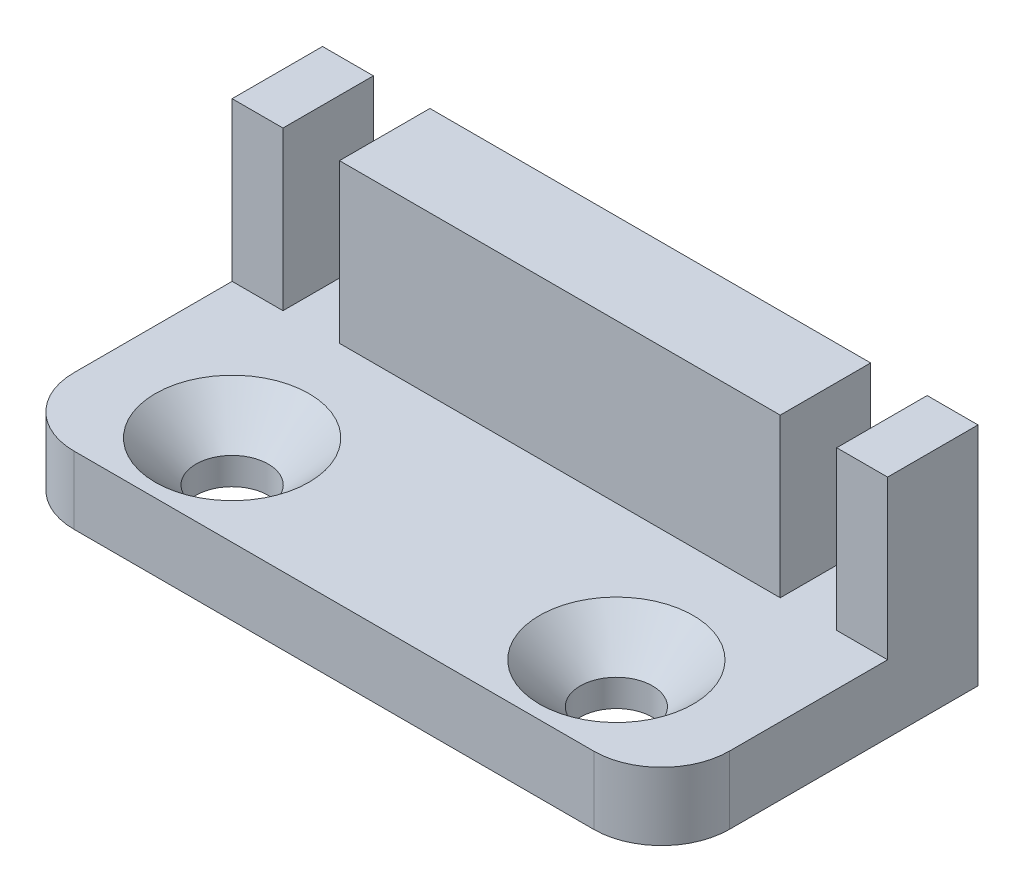
ISO-10303-21;
HEADER;
FILE_DESCRIPTION(('STEP AP214'),'2;1');
FILE_NAME('part.step','',(''),(''),'','','');
FILE_SCHEMA(('AUTOMOTIVE_DESIGN { 1 0 10303 214 1 1 1 1 }'));
ENDSEC;
DATA;
#1=APPLICATION_CONTEXT('core data for automotive mechanical design processes');
#2=APPLICATION_PROTOCOL_DEFINITION('international standard','automotive_design',2000,#1);
#3=PRODUCT_CONTEXT('',#1,'mechanical');
#4=PRODUCT('Part','Part','',(#3));
#5=PRODUCT_RELATED_PRODUCT_CATEGORY('part','',(#4));
#6=PRODUCT_DEFINITION_FORMATION('','',#4);
#7=PRODUCT_DEFINITION_CONTEXT('part definition',#1,'design');
#8=PRODUCT_DEFINITION('design','',#6,#7);
#9=PRODUCT_DEFINITION_SHAPE('','',#8);
#10=(LENGTH_UNIT() NAMED_UNIT(*) SI_UNIT(.MILLI.,.METRE.));
#11=(NAMED_UNIT(*) PLANE_ANGLE_UNIT() SI_UNIT($,.RADIAN.));
#12=(NAMED_UNIT(*) SI_UNIT($,.STERADIAN.) SOLID_ANGLE_UNIT());
#13=UNCERTAINTY_MEASURE_WITH_UNIT(LENGTH_MEASURE(1.E-05),#10,'distance_accuracy_value','');
#14=(GEOMETRIC_REPRESENTATION_CONTEXT(3) GLOBAL_UNCERTAINTY_ASSIGNED_CONTEXT((#13)) GLOBAL_UNIT_ASSIGNED_CONTEXT((#10,
#11,#12)) REPRESENTATION_CONTEXT('',''));
#15=CARTESIAN_POINT('',(0.,0.,0.));
#16=DIRECTION('',(0.,0.,1.));
#17=DIRECTION('',(1.,0.,0.));
#18=AXIS2_PLACEMENT_3D('',#15,#16,#17);
#19=CARTESIAN_POINT('',(0.,0.,4.));
#20=DIRECTION('',(0.,0.,-1.));
#21=DIRECTION('',(-1.,0.,0.));
#22=AXIS2_PLACEMENT_3D('',#19,#20,#21);
#23=PLANE('',#22);
#24=DIRECTION('',(-1.,0.,0.));
#25=VECTOR('',#24,1.);
#26=CARTESIAN_POINT('',(0.,3.,4.));
#27=LINE('',#26,#25);
#28=CARTESIAN_POINT('',(2.25,3.,4.));
#29=VERTEX_POINT('',#28);
#30=CARTESIAN_POINT('',(0.,3.,4.));
#31=VERTEX_POINT('',#30);
#32=EDGE_CURVE('E178',#29,#31,#27,.T.);
#33=ORIENTED_EDGE('',*,*,#32,.F.);
#34=DIRECTION('',(0.,1.,0.));
#35=VECTOR('',#34,1.);
#36=CARTESIAN_POINT('',(2.25,-1.7169905660283,4.));
#37=LINE('',#36,#35);
#38=CARTESIAN_POINT('',(2.25,10.,4.));
#39=VERTEX_POINT('',#38);
#40=EDGE_CURVE('E154',#29,#39,#37,.T.);
#41=ORIENTED_EDGE('',*,*,#40,.T.);
#42=DIRECTION('',(-1.,0.,0.));
#43=VECTOR('',#42,1.);
#44=CARTESIAN_POINT('',(0.,10.,4.));
#45=LINE('',#44,#43);
#46=CARTESIAN_POINT('',(0.,10.,4.));
#47=VERTEX_POINT('',#46);
#48=EDGE_CURVE('E225',#39,#47,#45,.T.);
#49=ORIENTED_EDGE('',*,*,#48,.T.);
#50=DIRECTION('',(0.,-1.,0.));
#51=VECTOR('',#50,1.);
#52=CARTESIAN_POINT('',(0.,0.,4.));
#53=LINE('',#52,#51);
#54=EDGE_CURVE('E219',#47,#31,#53,.T.);
#55=ORIENTED_EDGE('',*,*,#54,.T.);
#56=EDGE_LOOP('',(#33,#41,#49,#55));
#57=FACE_BOUND('',#56,.T.);
#58=ADVANCED_FACE('F35',(#57),#23,.F.);
#59=CARTESIAN_POINT('',(29.,10.,4.));
#60=VERTEX_POINT('',#59);
#61=CARTESIAN_POINT('',(26.75,10.,4.));
#62=VERTEX_POINT('',#61);
#63=EDGE_CURVE('E226',#60,#62,#45,.T.);
#64=ORIENTED_EDGE('',*,*,#63,.T.);
#65=DIRECTION('',(0.,1.,0.));
#66=VECTOR('',#65,1.);
#67=CARTESIAN_POINT('',(26.75,-1.7169905660283,4.));
#68=LINE('',#67,#66);
#69=CARTESIAN_POINT('',(26.75,3.,4.));
#70=VERTEX_POINT('',#69);
#71=EDGE_CURVE('E181',#70,#62,#68,.T.);
#72=ORIENTED_EDGE('',*,*,#71,.F.);
#73=CARTESIAN_POINT('',(29.,3.,4.));
#74=VERTEX_POINT('',#73);
#75=EDGE_CURVE('E208',#74,#70,#27,.T.);
#76=ORIENTED_EDGE('',*,*,#75,.F.);
#77=DIRECTION('',(0.,1.,0.));
#78=VECTOR('',#77,1.);
#79=CARTESIAN_POINT('',(29.,0.,4.));
#80=LINE('',#79,#78);
#81=EDGE_CURVE('E222',#74,#60,#80,.T.);
#82=ORIENTED_EDGE('',*,*,#81,.T.);
#83=EDGE_LOOP('',(#64,#72,#76,#82));
#84=FACE_BOUND('',#83,.T.);
#85=ADVANCED_FACE('F300',(#84),#23,.F.);
#86=CARTESIAN_POINT('',(0.,10.,4.));
#87=DIRECTION('',(0.,-1.,0.));
#88=DIRECTION('',(0.,0.,-1.));
#89=AXIS2_PLACEMENT_3D('',#86,#87,#88);
#90=PLANE('',#89);
#91=ORIENTED_EDGE('',*,*,#48,.F.);
#92=DIRECTION('',(0.,0.,1.));
#93=VECTOR('',#92,1.);
#94=CARTESIAN_POINT('',(2.25,10.,0.));
#95=LINE('',#94,#93);
#96=CARTESIAN_POINT('',(2.25,10.,0.));
#97=VERTEX_POINT('',#96);
#98=EDGE_CURVE('E166',#97,#39,#95,.T.);
#99=ORIENTED_EDGE('',*,*,#98,.F.);
#100=DIRECTION('',(-1.,0.,0.));
#101=VECTOR('',#100,1.);
#102=CARTESIAN_POINT('',(0.,10.,0.));
#103=LINE('',#102,#101);
#104=CARTESIAN_POINT('',(0.,10.,0.));
#105=VERTEX_POINT('',#104);
#106=EDGE_CURVE('E171',#97,#105,#103,.T.);
#107=ORIENTED_EDGE('',*,*,#106,.T.);
#108=DIRECTION('',(0.,0.,-1.));
#109=VECTOR('',#108,1.);
#110=CARTESIAN_POINT('',(0.,10.,4.));
#111=LINE('',#110,#109);
#112=EDGE_CURVE('E229',#47,#105,#111,.T.);
#113=ORIENTED_EDGE('',*,*,#112,.F.);
#114=EDGE_LOOP('',(#91,#99,#107,#113));
#115=FACE_BOUND('',#114,.T.);
#116=ADVANCED_FACE('F325',(#115),#90,.F.);
#117=CARTESIAN_POINT('',(29.,10.,0.));
#118=VERTEX_POINT('',#117);
#119=CARTESIAN_POINT('',(26.75,10.,0.));
#120=VERTEX_POINT('',#119);
#121=EDGE_CURVE('E223',#118,#120,#103,.T.);
#122=ORIENTED_EDGE('',*,*,#121,.T.);
#123=DIRECTION('',(0.,0.,-1.));
#124=VECTOR('',#123,1.);
#125=CARTESIAN_POINT('',(26.75,10.,0.));
#126=LINE('',#125,#124);
#127=EDGE_CURVE('E179',#62,#120,#126,.T.);
#128=ORIENTED_EDGE('',*,*,#127,.F.);
#129=ORIENTED_EDGE('',*,*,#63,.F.);
#130=DIRECTION('',(0.,0.,-1.));
#131=VECTOR('',#130,1.);
#132=CARTESIAN_POINT('',(29.,10.,4.));
#133=LINE('',#132,#131);
#134=EDGE_CURVE('E243',#60,#118,#133,.T.);
#135=ORIENTED_EDGE('',*,*,#134,.T.);
#136=EDGE_LOOP('',(#122,#128,#129,#135));
#137=FACE_BOUND('',#136,.T.);
#138=ADVANCED_FACE('F306',(#137),#90,.F.);
#139=CARTESIAN_POINT('',(24.25,10.,4.));
#140=VERTEX_POINT('',#139);
#141=CARTESIAN_POINT('',(4.75,10.,4.));
#142=VERTEX_POINT('',#141);
#143=EDGE_CURVE('E230',#140,#142,#45,.T.);
#144=ORIENTED_EDGE('',*,*,#143,.T.);
#145=DIRECTION('',(0.,1.,0.));
#146=VECTOR('',#145,1.);
#147=CARTESIAN_POINT('',(4.75,-1.7169905660283,4.));
#148=LINE('',#147,#146);
#149=CARTESIAN_POINT('',(4.75,3.,4.));
#150=VERTEX_POINT('',#149);
#151=EDGE_CURVE('E327',#150,#142,#148,.T.);
#152=ORIENTED_EDGE('',*,*,#151,.F.);
#153=CARTESIAN_POINT('',(24.25,3.,4.));
#154=VERTEX_POINT('',#153);
#155=EDGE_CURVE('E214',#154,#150,#27,.T.);
#156=ORIENTED_EDGE('',*,*,#155,.F.);
#157=DIRECTION('',(0.,1.,0.));
#158=VECTOR('',#157,1.);
#159=CARTESIAN_POINT('',(24.25,-1.7169905660283,4.));
#160=LINE('',#159,#158);
#161=EDGE_CURVE('E188',#154,#140,#160,.T.);
#162=ORIENTED_EDGE('',*,*,#161,.T.);
#163=EDGE_LOOP('',(#144,#152,#156,#162));
#164=FACE_BOUND('',#163,.T.);
#165=ADVANCED_FACE('F326',(#164),#23,.F.);
#166=CARTESIAN_POINT('',(0.,0.,4.));
#167=DIRECTION('',(1.,0.,0.));
#168=DIRECTION('',(0.,0.,-1.));
#169=AXIS2_PLACEMENT_3D('',#166,#167,#168);
#170=PLANE('',#169);
#171=DIRECTION('',(0.,0.,-1.));
#172=VECTOR('',#171,1.);
#173=CARTESIAN_POINT('',(0.,0.,4.));
#174=LINE('',#173,#172);
#175=CARTESIAN_POINT('',(0.,0.,11.));
#176=VERTEX_POINT('',#175);
#177=CARTESIAN_POINT('',(0.,0.,0.));
#178=VERTEX_POINT('',#177);
#179=EDGE_CURVE('E248',#176,#178,#174,.T.);
#180=ORIENTED_EDGE('',*,*,#179,.F.);
#181=DIRECTION('',(0.,-1.,0.));
#182=VECTOR('',#181,1.);
#183=CARTESIAN_POINT('',(0.,0.,11.));
#184=LINE('',#183,#182);
#185=CARTESIAN_POINT('',(0.,3.,11.));
#186=VERTEX_POINT('',#185);
#187=EDGE_CURVE('E58',#176,#186,#184,.F.);
#188=ORIENTED_EDGE('',*,*,#187,.T.);
#189=DIRECTION('',(0.,0.,-1.));
#190=VECTOR('',#189,1.);
#191=CARTESIAN_POINT('',(0.,3.,14.));
#192=LINE('',#191,#190);
#193=EDGE_CURVE('E211',#186,#31,#192,.T.);
#194=ORIENTED_EDGE('',*,*,#193,.T.);
#195=ORIENTED_EDGE('',*,*,#54,.F.);
#196=ORIENTED_EDGE('',*,*,#112,.T.);
#197=DIRECTION('',(0.,-1.,0.));
#198=VECTOR('',#197,1.);
#199=CARTESIAN_POINT('',(0.,0.,0.));
#200=LINE('',#199,#198);
#201=EDGE_CURVE('E218',#105,#178,#200,.T.);
#202=ORIENTED_EDGE('',*,*,#201,.T.);
#203=EDGE_LOOP('',(#180,#188,#194,#195,#196,#202));
#204=FACE_BOUND('',#203,.T.);
#205=ADVANCED_FACE('F284',(#204),#170,.F.);
#206=CARTESIAN_POINT('',(0.,0.,4.));
#207=DIRECTION('',(0.,1.,0.));
#208=DIRECTION('',(0.,0.,1.));
#209=AXIS2_PLACEMENT_3D('',#206,#207,#208);
#210=PLANE('',#209);
#211=CARTESIAN_POINT('',(6.,0.,10.));
#212=DIRECTION('',(0.,1.,0.));
#213=DIRECTION('',(0.,0.,1.));
#214=AXIS2_PLACEMENT_3D('',#211,#212,#213);
#215=CIRCLE('',#214,1.6);
#216=CARTESIAN_POINT('',(6.,0.,11.6));
#217=VERTEX_POINT('',#216);
#218=EDGE_CURVE('E184',#217,#217,#215,.F.);
#219=ORIENTED_EDGE('',*,*,#218,.F.);
#220=EDGE_LOOP('',(#219));
#221=FACE_BOUND('',#220,.T.);
#222=CARTESIAN_POINT('',(23.,0.,10.));
#223=DIRECTION('',(0.,1.,0.));
#224=DIRECTION('',(0.,0.,1.));
#225=AXIS2_PLACEMENT_3D('',#222,#223,#224);
#226=CIRCLE('',#225,1.6);
#227=CARTESIAN_POINT('',(23.,0.,11.6));
#228=VERTEX_POINT('',#227);
#229=EDGE_CURVE('E333',#228,#228,#226,.F.);
#230=ORIENTED_EDGE('',*,*,#229,.F.);
#231=EDGE_LOOP('',(#230));
#232=FACE_BOUND('',#231,.T.);
#233=DIRECTION('',(1.,0.,0.));
#234=VECTOR('',#233,1.);
#235=CARTESIAN_POINT('',(0.,0.,14.));
#236=LINE('',#235,#234);
#237=CARTESIAN_POINT('',(3.,0.,14.));
#238=VERTEX_POINT('',#237);
#239=CARTESIAN_POINT('',(26.,0.,14.));
#240=VERTEX_POINT('',#239);
#241=EDGE_CURVE('E204',#238,#240,#236,.T.);
#242=ORIENTED_EDGE('',*,*,#241,.F.);
#243=CARTESIAN_POINT('',(3.,0.,11.));
#244=DIRECTION('',(0.,1.,0.));
#245=DIRECTION('',(0.,0.,1.));
#246=AXIS2_PLACEMENT_3D('',#243,#244,#245);
#247=CIRCLE('',#246,3.);
#248=EDGE_CURVE('E270',#238,#176,#247,.F.);
#249=ORIENTED_EDGE('',*,*,#248,.T.);
#250=ORIENTED_EDGE('',*,*,#179,.T.);
#251=DIRECTION('',(1.,0.,0.));
#252=VECTOR('',#251,1.);
#253=CARTESIAN_POINT('',(0.,0.,0.));
#254=LINE('',#253,#252);
#255=CARTESIAN_POINT('',(29.,0.,0.));
#256=VERTEX_POINT('',#255);
#257=EDGE_CURVE('E233',#178,#256,#254,.T.);
#258=ORIENTED_EDGE('',*,*,#257,.T.);
#259=DIRECTION('',(0.,0.,-1.));
#260=VECTOR('',#259,1.);
#261=CARTESIAN_POINT('',(29.,0.,4.));
#262=LINE('',#261,#260);
#263=CARTESIAN_POINT('',(29.,0.,11.));
#264=VERTEX_POINT('',#263);
#265=EDGE_CURVE('E246',#264,#256,#262,.T.);
#266=ORIENTED_EDGE('',*,*,#265,.F.);
#267=CARTESIAN_POINT('',(26.,0.,11.));
#268=DIRECTION('',(0.,1.,0.));
#269=DIRECTION('',(0.,0.,1.));
#270=AXIS2_PLACEMENT_3D('',#267,#268,#269);
#271=CIRCLE('',#270,3.);
#272=EDGE_CURVE('E268',#264,#240,#271,.F.);
#273=ORIENTED_EDGE('',*,*,#272,.T.);
#274=EDGE_LOOP('',(#242,#249,#250,#258,#266,#273));
#275=FACE_BOUND('',#274,.T.);
#276=ADVANCED_FACE('F282',(#221,#232,#275),#210,.F.);
#277=CARTESIAN_POINT('',(29.,0.,4.));
#278=DIRECTION('',(-1.,0.,0.));
#279=DIRECTION('',(0.,0.,1.));
#280=AXIS2_PLACEMENT_3D('',#277,#278,#279);
#281=PLANE('',#280);
#282=DIRECTION('',(0.,0.,-1.));
#283=VECTOR('',#282,1.);
#284=CARTESIAN_POINT('',(29.,3.,14.));
#285=LINE('',#284,#283);
#286=CARTESIAN_POINT('',(29.,3.,11.));
#287=VERTEX_POINT('',#286);
#288=EDGE_CURVE('E216',#287,#74,#285,.T.);
#289=ORIENTED_EDGE('',*,*,#288,.F.);
#290=DIRECTION('',(0.,1.,0.));
#291=VECTOR('',#290,1.);
#292=CARTESIAN_POINT('',(29.,0.,11.));
#293=LINE('',#292,#291);
#294=EDGE_CURVE('E11',#287,#264,#293,.F.);
#295=ORIENTED_EDGE('',*,*,#294,.T.);
#296=ORIENTED_EDGE('',*,*,#265,.T.);
#297=DIRECTION('',(0.,1.,0.));
#298=VECTOR('',#297,1.);
#299=CARTESIAN_POINT('',(29.,0.,0.));
#300=LINE('',#299,#298);
#301=EDGE_CURVE('E236',#256,#118,#300,.T.);
#302=ORIENTED_EDGE('',*,*,#301,.T.);
#303=ORIENTED_EDGE('',*,*,#134,.F.);
#304=ORIENTED_EDGE('',*,*,#81,.F.);
#305=EDGE_LOOP('',(#289,#295,#296,#302,#303,#304));
#306=FACE_BOUND('',#305,.T.);
#307=ADVANCED_FACE('F294',(#306),#281,.F.);
#308=CARTESIAN_POINT('',(24.25,10.,0.));
#309=VERTEX_POINT('',#308);
#310=CARTESIAN_POINT('',(4.75,10.,0.));
#311=VERTEX_POINT('',#310);
#312=EDGE_CURVE('E240',#309,#311,#103,.T.);
#313=ORIENTED_EDGE('',*,*,#312,.T.);
#314=DIRECTION('',(0.,0.,-1.));
#315=VECTOR('',#314,1.);
#316=CARTESIAN_POINT('',(4.75,10.,0.));
#317=LINE('',#316,#315);
#318=EDGE_CURVE('E203',#142,#311,#317,.T.);
#319=ORIENTED_EDGE('',*,*,#318,.F.);
#320=ORIENTED_EDGE('',*,*,#143,.F.);
#321=DIRECTION('',(0.,0.,1.));
#322=VECTOR('',#321,1.);
#323=CARTESIAN_POINT('',(24.25,10.,0.));
#324=LINE('',#323,#322);
#325=EDGE_CURVE('E182',#309,#140,#324,.T.);
#326=ORIENTED_EDGE('',*,*,#325,.F.);
#327=EDGE_LOOP('',(#313,#319,#320,#326));
#328=FACE_BOUND('',#327,.T.);
#329=ADVANCED_FACE('F317',(#328),#90,.F.);
#330=CARTESIAN_POINT('',(0.,0.,0.));
#331=DIRECTION('',(0.,0.,-1.));
#332=DIRECTION('',(-1.,0.,0.));
#333=AXIS2_PLACEMENT_3D('',#330,#331,#332);
#334=PLANE('',#333);
#335=DIRECTION('',(0.,1.,0.));
#336=VECTOR('',#335,1.);
#337=CARTESIAN_POINT('',(2.25,-1.7169905660283,0.));
#338=LINE('',#337,#336);
#339=CARTESIAN_POINT('',(2.25,3.,0.));
#340=VERTEX_POINT('',#339);
#341=EDGE_CURVE('E151',#340,#97,#338,.T.);
#342=ORIENTED_EDGE('',*,*,#341,.F.);
#343=DIRECTION('',(-1.,0.,0.));
#344=VECTOR('',#343,1.);
#345=CARTESIAN_POINT('',(4.75,3.,0.));
#346=LINE('',#345,#344);
#347=CARTESIAN_POINT('',(4.75,3.,0.));
#348=VERTEX_POINT('',#347);
#349=EDGE_CURVE('E159',#348,#340,#346,.T.);
#350=ORIENTED_EDGE('',*,*,#349,.F.);
#351=DIRECTION('',(0.,1.,0.));
#352=VECTOR('',#351,1.);
#353=CARTESIAN_POINT('',(4.75,-1.7169905660283,0.));
#354=LINE('',#353,#352);
#355=EDGE_CURVE('E176',#348,#311,#354,.T.);
#356=ORIENTED_EDGE('',*,*,#355,.T.);
#357=ORIENTED_EDGE('',*,*,#312,.F.);
#358=DIRECTION('',(0.,1.,0.));
#359=VECTOR('',#358,1.);
#360=CARTESIAN_POINT('',(24.25,-1.7169905660283,0.));
#361=LINE('',#360,#359);
#362=CARTESIAN_POINT('',(24.25,3.,0.));
#363=VERTEX_POINT('',#362);
#364=EDGE_CURVE('E189',#363,#309,#361,.T.);
#365=ORIENTED_EDGE('',*,*,#364,.F.);
#366=DIRECTION('',(-1.,0.,0.));
#367=VECTOR('',#366,1.);
#368=CARTESIAN_POINT('',(24.25,3.,0.));
#369=LINE('',#368,#367);
#370=CARTESIAN_POINT('',(26.75,3.,0.));
#371=VERTEX_POINT('',#370);
#372=EDGE_CURVE('E190',#371,#363,#369,.T.);
#373=ORIENTED_EDGE('',*,*,#372,.F.);
#374=DIRECTION('',(0.,1.,0.));
#375=VECTOR('',#374,1.);
#376=CARTESIAN_POINT('',(26.75,-1.7169905660283,0.));
#377=LINE('',#376,#375);
#378=EDGE_CURVE('E193',#371,#120,#377,.T.);
#379=ORIENTED_EDGE('',*,*,#378,.T.);
#380=ORIENTED_EDGE('',*,*,#121,.F.);
#381=ORIENTED_EDGE('',*,*,#301,.F.);
#382=ORIENTED_EDGE('',*,*,#257,.F.);
#383=ORIENTED_EDGE('',*,*,#201,.F.);
#384=ORIENTED_EDGE('',*,*,#106,.F.);
#385=EDGE_LOOP('',(#342,#350,#356,#357,#365,#373,#379,#380,#381,#382,#383,#384));
#386=FACE_BOUND('',#385,.T.);
#387=ADVANCED_FACE('F169',(#386),#334,.T.);
#388=CARTESIAN_POINT('',(0.,3.,14.));
#389=DIRECTION('',(0.,-1.,0.));
#390=DIRECTION('',(0.,0.,-1.));
#391=AXIS2_PLACEMENT_3D('',#388,#389,#390);
#392=PLANE('',#391);
#393=CARTESIAN_POINT('',(23.,3.,10.));
#394=DIRECTION('',(0.,-1.,0.));
#395=DIRECTION('',(0.,0.,-1.));
#396=AXIS2_PLACEMENT_3D('',#393,#394,#395);
#397=CIRCLE('',#396,3.40000000000002);
#398=CARTESIAN_POINT('',(23.,3.,13.4));
#399=VERTEX_POINT('',#398);
#400=EDGE_CURVE('E256',#399,#399,#397,.T.);
#401=ORIENTED_EDGE('',*,*,#400,.T.);
#402=EDGE_LOOP('',(#401));
#403=FACE_BOUND('',#402,.T.);
#404=CARTESIAN_POINT('',(6.,3.,10.));
#405=DIRECTION('',(0.,-1.,0.));
#406=DIRECTION('',(0.,0.,-1.));
#407=AXIS2_PLACEMENT_3D('',#404,#405,#406);
#408=CIRCLE('',#407,3.40000000000002);
#409=CARTESIAN_POINT('',(6.,3.,6.59999999999998));
#410=VERTEX_POINT('',#409);
#411=EDGE_CURVE('E253',#410,#410,#408,.T.);
#412=ORIENTED_EDGE('',*,*,#411,.T.);
#413=EDGE_LOOP('',(#412));
#414=FACE_BOUND('',#413,.T.);
#415=ORIENTED_EDGE('',*,*,#193,.F.);
#416=CARTESIAN_POINT('',(3.,3.,11.));
#417=DIRECTION('',(0.,-1.,0.));
#418=DIRECTION('',(0.,0.,-1.));
#419=AXIS2_PLACEMENT_3D('',#416,#417,#418);
#420=CIRCLE('',#419,3.);
#421=CARTESIAN_POINT('',(3.,3.,14.));
#422=VERTEX_POINT('',#421);
#423=EDGE_CURVE('E43',#186,#422,#420,.F.);
#424=ORIENTED_EDGE('',*,*,#423,.T.);
#425=DIRECTION('',(-1.,0.,0.));
#426=VECTOR('',#425,1.);
#427=CARTESIAN_POINT('',(0.,3.,14.));
#428=LINE('',#427,#426);
#429=CARTESIAN_POINT('',(26.,3.,14.));
#430=VERTEX_POINT('',#429);
#431=EDGE_CURVE('E207',#430,#422,#428,.T.);
#432=ORIENTED_EDGE('',*,*,#431,.F.);
#433=CARTESIAN_POINT('',(26.,3.,11.));
#434=DIRECTION('',(0.,-1.,0.));
#435=DIRECTION('',(0.,0.,-1.));
#436=AXIS2_PLACEMENT_3D('',#433,#434,#435);
#437=CIRCLE('',#436,3.);
#438=EDGE_CURVE('E50',#430,#287,#437,.F.);
#439=ORIENTED_EDGE('',*,*,#438,.T.);
#440=ORIENTED_EDGE('',*,*,#288,.T.);
#441=ORIENTED_EDGE('',*,*,#75,.T.);
#442=DIRECTION('',(0.,0.,-1.));
#443=VECTOR('',#442,1.);
#444=CARTESIAN_POINT('',(26.75,3.,0.));
#445=LINE('',#444,#443);
#446=EDGE_CURVE('E194',#70,#371,#445,.T.);
#447=ORIENTED_EDGE('',*,*,#446,.T.);
#448=ORIENTED_EDGE('',*,*,#372,.T.);
#449=DIRECTION('',(0.,0.,1.));
#450=VECTOR('',#449,1.);
#451=CARTESIAN_POINT('',(24.25,3.,0.));
#452=LINE('',#451,#450);
#453=EDGE_CURVE('E185',#363,#154,#452,.T.);
#454=ORIENTED_EDGE('',*,*,#453,.T.);
#455=ORIENTED_EDGE('',*,*,#155,.T.);
#456=DIRECTION('',(0.,0.,-1.));
#457=VECTOR('',#456,1.);
#458=CARTESIAN_POINT('',(4.75,3.,0.));
#459=LINE('',#458,#457);
#460=EDGE_CURVE('E162',#150,#348,#459,.T.);
#461=ORIENTED_EDGE('',*,*,#460,.T.);
#462=ORIENTED_EDGE('',*,*,#349,.T.);
#463=DIRECTION('',(0.,0.,1.));
#464=VECTOR('',#463,1.);
#465=CARTESIAN_POINT('',(2.25,3.,0.));
#466=LINE('',#465,#464);
#467=EDGE_CURVE('E147',#340,#29,#466,.T.);
#468=ORIENTED_EDGE('',*,*,#467,.T.);
#469=ORIENTED_EDGE('',*,*,#32,.T.);
#470=EDGE_LOOP('',(#415,#424,#432,#439,#440,#441,#447,#448,#454,#455,#461,#462,#468,#469));
#471=FACE_BOUND('',#470,.T.);
#472=ADVANCED_FACE('F160',(#403,#414,#471),#392,.F.);
#473=CARTESIAN_POINT('',(0.,0.,14.));
#474=DIRECTION('',(0.,0.,-1.));
#475=DIRECTION('',(-1.,0.,0.));
#476=AXIS2_PLACEMENT_3D('',#473,#474,#475);
#477=PLANE('',#476);
#478=ORIENTED_EDGE('',*,*,#431,.T.);
#479=DIRECTION('',(0.,-1.,0.));
#480=VECTOR('',#479,1.);
#481=CARTESIAN_POINT('',(3.,0.,14.));
#482=LINE('',#481,#480);
#483=EDGE_CURVE('E265',#422,#238,#482,.T.);
#484=ORIENTED_EDGE('',*,*,#483,.T.);
#485=ORIENTED_EDGE('',*,*,#241,.T.);
#486=DIRECTION('',(0.,1.,0.));
#487=VECTOR('',#486,1.);
#488=CARTESIAN_POINT('',(26.,0.,14.));
#489=LINE('',#488,#487);
#490=EDGE_CURVE('E262',#240,#430,#489,.T.);
#491=ORIENTED_EDGE('',*,*,#490,.T.);
#492=EDGE_LOOP('',(#478,#484,#485,#491));
#493=FACE_BOUND('',#492,.T.);
#494=ADVANCED_FACE('F277',(#493),#477,.F.);
#495=CARTESIAN_POINT('',(26.75,-1.7169905660283,0.));
#496=DIRECTION('',(1.,0.,0.));
#497=DIRECTION('',(0.,0.,-1.));
#498=AXIS2_PLACEMENT_3D('',#495,#496,#497);
#499=PLANE('',#498);
#500=ORIENTED_EDGE('',*,*,#71,.T.);
#501=ORIENTED_EDGE('',*,*,#127,.T.);
#502=ORIENTED_EDGE('',*,*,#378,.F.);
#503=ORIENTED_EDGE('',*,*,#446,.F.);
#504=EDGE_LOOP('',(#500,#501,#502,#503));
#505=FACE_BOUND('',#504,.T.);
#506=ADVANCED_FACE('F304',(#505),#499,.F.);
#507=CARTESIAN_POINT('',(24.25,-1.7169905660283,0.));
#508=DIRECTION('',(-1.,0.,0.));
#509=DIRECTION('',(0.,0.,1.));
#510=AXIS2_PLACEMENT_3D('',#507,#508,#509);
#511=PLANE('',#510);
#512=ORIENTED_EDGE('',*,*,#364,.T.);
#513=ORIENTED_EDGE('',*,*,#325,.T.);
#514=ORIENTED_EDGE('',*,*,#161,.F.);
#515=ORIENTED_EDGE('',*,*,#453,.F.);
#516=EDGE_LOOP('',(#512,#513,#514,#515));
#517=FACE_BOUND('',#516,.T.);
#518=ADVANCED_FACE('F314',(#517),#511,.F.);
#519=CARTESIAN_POINT('',(2.25,-1.7169905660283,0.));
#520=DIRECTION('',(-1.,0.,0.));
#521=DIRECTION('',(0.,0.,1.));
#522=AXIS2_PLACEMENT_3D('',#519,#520,#521);
#523=PLANE('',#522);
#524=ORIENTED_EDGE('',*,*,#341,.T.);
#525=ORIENTED_EDGE('',*,*,#98,.T.);
#526=ORIENTED_EDGE('',*,*,#40,.F.);
#527=ORIENTED_EDGE('',*,*,#467,.F.);
#528=EDGE_LOOP('',(#524,#525,#526,#527));
#529=FACE_BOUND('',#528,.T.);
#530=ADVANCED_FACE('F149',(#529),#523,.F.);
#531=CARTESIAN_POINT('',(4.75,-1.7169905660283,0.));
#532=DIRECTION('',(1.,0.,0.));
#533=DIRECTION('',(0.,0.,-1.));
#534=AXIS2_PLACEMENT_3D('',#531,#532,#533);
#535=PLANE('',#534);
#536=ORIENTED_EDGE('',*,*,#151,.T.);
#537=ORIENTED_EDGE('',*,*,#318,.T.);
#538=ORIENTED_EDGE('',*,*,#355,.F.);
#539=ORIENTED_EDGE('',*,*,#460,.F.);
#540=EDGE_LOOP('',(#536,#537,#538,#539));
#541=FACE_BOUND('',#540,.T.);
#542=ADVANCED_FACE('F348',(#541),#535,.F.);
#543=CARTESIAN_POINT('',(23.,-0.00100000000000013,10.));
#544=DIRECTION('',(0.,1.,0.));
#545=DIRECTION('',(0.,0.,1.));
#546=AXIS2_PLACEMENT_3D('',#543,#544,#545);
#547=CYLINDRICAL_SURFACE('',#546,1.6);
#548=CARTESIAN_POINT('',(23.,1.19999999999998,10.));
#549=DIRECTION('',(0.,-1.,0.));
#550=DIRECTION('',(0.,0.,-1.));
#551=AXIS2_PLACEMENT_3D('',#548,#549,#550);
#552=CIRCLE('',#551,1.6);
#553=CARTESIAN_POINT('',(23.,1.19999999999998,11.6));
#554=VERTEX_POINT('',#553);
#555=EDGE_CURVE('E250',#554,#554,#552,.F.);
#556=CARTESIAN_POINT('',(23.,1.19999999999998,11.6));
#557=CARTESIAN_POINT('',(23.,1.18749999999998,11.6));
#558=CARTESIAN_POINT('',(23.,1.17499999999998,11.6));
#559=CARTESIAN_POINT('',(23.,1.14999999999998,11.6));
#560=CARTESIAN_POINT('',(23.,1.13749999999998,11.6));
#561=CARTESIAN_POINT('',(23.,1.11249999999998,11.6));
#562=CARTESIAN_POINT('',(23.,1.09999999999998,11.6));
#563=CARTESIAN_POINT('',(23.,1.07499999999998,11.6));
#564=CARTESIAN_POINT('',(23.,1.06249999999998,11.6));
#565=CARTESIAN_POINT('',(23.,1.03749999999999,11.6));
#566=CARTESIAN_POINT('',(23.,1.02499999999999,11.6));
#567=CARTESIAN_POINT('',(23.,0.999999999999986,11.6));
#568=CARTESIAN_POINT('',(23.,0.987499999999986,11.6));
#569=CARTESIAN_POINT('',(23.,0.962499999999986,11.6));
#570=CARTESIAN_POINT('',(23.,0.949999999999987,11.6));
#571=CARTESIAN_POINT('',(23.,0.924999999999987,11.6));
#572=CARTESIAN_POINT('',(23.,0.912499999999987,11.6));
#573=CARTESIAN_POINT('',(23.,0.887499999999988,11.6));
#574=CARTESIAN_POINT('',(23.,0.874999999999988,11.6));
#575=CARTESIAN_POINT('',(23.,0.849999999999988,11.6));
#576=CARTESIAN_POINT('',(23.,0.837499999999988,11.6));
#577=CARTESIAN_POINT('',(23.,0.812499999999989,11.6));
#578=CARTESIAN_POINT('',(23.,0.799999999999989,11.6));
#579=CARTESIAN_POINT('',(23.,0.774999999999989,11.6));
#580=CARTESIAN_POINT('',(23.,0.762499999999989,11.6));
#581=CARTESIAN_POINT('',(23.,0.73749999999999,11.6));
#582=CARTESIAN_POINT('',(23.,0.72499999999999,11.6));
#583=CARTESIAN_POINT('',(23.,0.69999999999999,11.6));
#584=CARTESIAN_POINT('',(23.,0.68749999999999,11.6));
#585=CARTESIAN_POINT('',(23.,0.662499999999991,11.6));
#586=CARTESIAN_POINT('',(23.,0.649999999999991,11.6));
#587=CARTESIAN_POINT('',(23.,0.624999999999991,11.6));
#588=CARTESIAN_POINT('',(23.,0.612499999999991,11.6));
#589=CARTESIAN_POINT('',(23.,0.587499999999992,11.6));
#590=CARTESIAN_POINT('',(23.,0.574999999999992,11.6));
#591=CARTESIAN_POINT('',(23.,0.549999999999992,11.6));
#592=CARTESIAN_POINT('',(23.,0.537499999999992,11.6));
#593=CARTESIAN_POINT('',(23.,0.512499999999993,11.6));
#594=CARTESIAN_POINT('',(23.,0.499999999999993,11.6));
#595=CARTESIAN_POINT('',(23.,0.474999999999993,11.6));
#596=CARTESIAN_POINT('',(23.,0.462499999999993,11.6));
#597=CARTESIAN_POINT('',(23.,0.437499999999994,11.6));
#598=CARTESIAN_POINT('',(23.,0.424999999999994,11.6));
#599=CARTESIAN_POINT('',(23.,0.399999999999994,11.6));
#600=CARTESIAN_POINT('',(23.,0.387499999999995,11.6));
#601=CARTESIAN_POINT('',(23.,0.362499999999995,11.6));
#602=CARTESIAN_POINT('',(23.,0.349999999999995,11.6));
#603=CARTESIAN_POINT('',(23.,0.324999999999995,11.6));
#604=CARTESIAN_POINT('',(23.,0.312499999999996,11.6));
#605=CARTESIAN_POINT('',(23.,0.287499999999996,11.6));
#606=CARTESIAN_POINT('',(23.,0.274999999999996,11.6));
#607=CARTESIAN_POINT('',(23.,0.249999999999996,11.6));
#608=CARTESIAN_POINT('',(23.,0.237499999999997,11.6));
#609=CARTESIAN_POINT('',(23.,0.212499999999997,11.6));
#610=CARTESIAN_POINT('',(23.,0.199999999999997,11.6));
#611=CARTESIAN_POINT('',(23.,0.174999999999997,11.6));
#612=CARTESIAN_POINT('',(23.,0.162499999999998,11.6));
#613=CARTESIAN_POINT('',(23.,0.137499999999998,11.6));
#614=CARTESIAN_POINT('',(23.,0.124999999999998,11.6));
#615=CARTESIAN_POINT('',(23.,0.0999999999999986,11.6));
#616=CARTESIAN_POINT('',(23.,0.0874999999999987,11.6));
#617=CARTESIAN_POINT('',(23.,0.0624999999999991,11.6));
#618=CARTESIAN_POINT('',(23.,0.0499999999999993,11.6));
#619=CARTESIAN_POINT('',(23.,0.0249999999999997,11.6));
#620=CARTESIAN_POINT('',(23.,0.0124999999999999,11.6));
#621=CARTESIAN_POINT('',(23.,0.,11.6));
#622=B_SPLINE_CURVE_WITH_KNOTS('',3,(#556,#557,#558,#559,#560,#561,#562,#563,#564,#565,#566,
#567,#568,#569,#570,#571,#572,#573,#574,#575,#576,#577,#578,#579,#580,#581,#582,#583,#584,#585,
#586,#587,#588,#589,#590,#591,#592,#593,#594,#595,#596,#597,#598,#599,#600,#601,#602,#603,#604,
#605,#606,#607,#608,#609,#610,#611,#612,#613,#614,#615,#616,#617,#618,#619,#620,#621),
.UNSPECIFIED.,.F.,.F.,(4,2,2,2,2,2,2,2,2,2,2,2,2,2,2,2,2,2,2,2,2,2,2,2,2,2,2,2,2,2,2,2,4),(0.,
0.0374999999999996,0.0749999999999989,0.112499999999998,0.149999999999998,0.187499999999997,
0.224999999999997,0.262499999999996,0.299999999999996,0.337499999999995,0.374999999999995,
0.412499999999994,0.449999999999994,0.487499999999993,0.524999999999993,0.562499999999992,
0.599999999999992,0.637499999999991,0.67499999999999,0.71249999999999,0.749999999999989,
0.787499999999989,0.824999999999988,0.862499999999988,0.899999999999987,0.937499999999987,
0.974999999999986,1.01249999999999,1.04999999999999,1.08749999999998,1.12499999999998,
1.16249999999998,1.19999999999998),.UNSPECIFIED.);
#623=EDGE_CURVE('BSEAM346',#554,#228,#622,.T.);
#624=ORIENTED_EDGE('',*,*,#555,.T.);
#625=ORIENTED_EDGE('',*,*,#229,.T.);
#626=ORIENTED_EDGE('',*,*,#623,.T.);
#627=ORIENTED_EDGE('',*,*,#623,.F.);
#628=EDGE_LOOP('',(#624,#626,#625,#627));
#629=FACE_BOUND('',#628,.T.);
#630=ADVANCED_FACE('F346',(#629),#547,.F.);
#631=CARTESIAN_POINT('',(6.,-0.00100000000000013,10.));
#632=DIRECTION('',(0.,1.,0.));
#633=DIRECTION('',(0.,0.,1.));
#634=AXIS2_PLACEMENT_3D('',#631,#632,#633);
#635=CYLINDRICAL_SURFACE('',#634,1.6);
#636=CARTESIAN_POINT('',(6.,1.19999999999998,10.));
#637=DIRECTION('',(0.,-1.,0.));
#638=DIRECTION('',(0.,0.,-1.));
#639=AXIS2_PLACEMENT_3D('',#636,#637,#638);
#640=CIRCLE('',#639,1.6);
#641=CARTESIAN_POINT('',(6.,1.19999999999998,11.6));
#642=VERTEX_POINT('',#641);
#643=EDGE_CURVE('E259',#642,#642,#640,.F.);
#644=CARTESIAN_POINT('',(6.,1.19999999999998,11.6));
#645=CARTESIAN_POINT('',(6.,1.18749999999998,11.6));
#646=CARTESIAN_POINT('',(6.,1.17499999999998,11.6));
#647=CARTESIAN_POINT('',(6.,1.14999999999998,11.6));
#648=CARTESIAN_POINT('',(6.,1.13749999999998,11.6));
#649=CARTESIAN_POINT('',(6.,1.11249999999998,11.6));
#650=CARTESIAN_POINT('',(6.,1.09999999999998,11.6));
#651=CARTESIAN_POINT('',(6.,1.07499999999998,11.6));
#652=CARTESIAN_POINT('',(6.,1.06249999999998,11.6));
#653=CARTESIAN_POINT('',(6.,1.03749999999998,11.6));
#654=CARTESIAN_POINT('',(6.,1.02499999999998,11.6));
#655=CARTESIAN_POINT('',(6.,0.999999999999984,11.6));
#656=CARTESIAN_POINT('',(6.,0.987499999999985,11.6));
#657=CARTESIAN_POINT('',(6.,0.962499999999985,11.6));
#658=CARTESIAN_POINT('',(6.,0.949999999999985,11.6));
#659=CARTESIAN_POINT('',(6.,0.924999999999986,11.6));
#660=CARTESIAN_POINT('',(6.,0.912499999999986,11.6));
#661=CARTESIAN_POINT('',(6.,0.887499999999986,11.6));
#662=CARTESIAN_POINT('',(6.,0.874999999999986,11.6));
#663=CARTESIAN_POINT('',(6.,0.849999999999987,11.6));
#664=CARTESIAN_POINT('',(6.,0.837499999999987,11.6));
#665=CARTESIAN_POINT('',(6.,0.812499999999987,11.6));
#666=CARTESIAN_POINT('',(6.,0.799999999999988,11.6));
#667=CARTESIAN_POINT('',(6.,0.774999999999988,11.6));
#668=CARTESIAN_POINT('',(6.,0.762499999999988,11.6));
#669=CARTESIAN_POINT('',(6.,0.737499999999988,11.6));
#670=CARTESIAN_POINT('',(6.,0.724999999999989,11.6));
#671=CARTESIAN_POINT('',(6.,0.699999999999989,11.6));
#672=CARTESIAN_POINT('',(6.,0.687499999999989,11.6));
#673=CARTESIAN_POINT('',(6.,0.66249999999999,11.6));
#674=CARTESIAN_POINT('',(6.,0.64999999999999,11.6));
#675=CARTESIAN_POINT('',(6.,0.62499999999999,11.6));
#676=CARTESIAN_POINT('',(6.,0.61249999999999,11.6));
#677=CARTESIAN_POINT('',(6.,0.587499999999991,11.6));
#678=CARTESIAN_POINT('',(6.,0.574999999999991,11.6));
#679=CARTESIAN_POINT('',(6.,0.549999999999991,11.6));
#680=CARTESIAN_POINT('',(6.,0.537499999999992,11.6));
#681=CARTESIAN_POINT('',(6.,0.512499999999992,11.6));
#682=CARTESIAN_POINT('',(6.,0.499999999999992,11.6));
#683=CARTESIAN_POINT('',(6.,0.474999999999993,11.6));
#684=CARTESIAN_POINT('',(6.,0.462499999999993,11.6));
#685=CARTESIAN_POINT('',(6.,0.437499999999993,11.6));
#686=CARTESIAN_POINT('',(6.,0.424999999999993,11.6));
#687=CARTESIAN_POINT('',(6.,0.399999999999994,11.6));
#688=CARTESIAN_POINT('',(6.,0.387499999999994,11.6));
#689=CARTESIAN_POINT('',(6.,0.362499999999994,11.6));
#690=CARTESIAN_POINT('',(6.,0.349999999999995,11.6));
#691=CARTESIAN_POINT('',(6.,0.324999999999995,11.6));
#692=CARTESIAN_POINT('',(6.,0.312499999999995,11.6));
#693=CARTESIAN_POINT('',(6.,0.287499999999995,11.6));
#694=CARTESIAN_POINT('',(6.,0.274999999999996,11.6));
#695=CARTESIAN_POINT('',(6.,0.249999999999996,11.6));
#696=CARTESIAN_POINT('',(6.,0.237499999999996,11.6));
#697=CARTESIAN_POINT('',(6.,0.212499999999997,11.6));
#698=CARTESIAN_POINT('',(6.,0.199999999999997,11.6));
#699=CARTESIAN_POINT('',(6.,0.174999999999997,11.6));
#700=CARTESIAN_POINT('',(6.,0.162499999999998,11.6));
#701=CARTESIAN_POINT('',(6.,0.137499999999998,11.6));
#702=CARTESIAN_POINT('',(6.,0.124999999999998,11.6));
#703=CARTESIAN_POINT('',(6.,0.0999999999999985,11.6));
#704=CARTESIAN_POINT('',(6.,0.0874999999999987,11.6));
#705=CARTESIAN_POINT('',(6.,0.062499999999999,11.6));
#706=CARTESIAN_POINT('',(6.,0.0499999999999992,11.6));
#707=CARTESIAN_POINT('',(6.,0.0249999999999996,11.6));
#708=CARTESIAN_POINT('',(6.,0.0124999999999998,11.6));
#709=CARTESIAN_POINT('',(6.,0.,11.6));
#710=B_SPLINE_CURVE_WITH_KNOTS('',3,(#644,#645,#646,#647,#648,#649,#650,#651,#652,#653,#654,
#655,#656,#657,#658,#659,#660,#661,#662,#663,#664,#665,#666,#667,#668,#669,#670,#671,#672,#673,
#674,#675,#676,#677,#678,#679,#680,#681,#682,#683,#684,#685,#686,#687,#688,#689,#690,#691,#692,
#693,#694,#695,#696,#697,#698,#699,#700,#701,#702,#703,#704,#705,#706,#707,#708,#709),
.UNSPECIFIED.,.F.,.F.,(4,2,2,2,2,2,2,2,2,2,2,2,2,2,2,2,2,2,2,2,2,2,2,2,2,2,2,2,2,2,2,2,4),(0.,
0.0374999999999993,0.0749999999999989,0.112499999999998,0.149999999999998,0.187499999999997,
0.224999999999996,0.262499999999996,0.299999999999995,0.337499999999995,0.374999999999994,
0.412499999999993,0.449999999999993,0.487499999999992,0.524999999999992,0.562499999999991,
0.599999999999991,0.63749999999999,0.674999999999989,0.712499999999989,0.749999999999988,
0.787499999999988,0.824999999999987,0.862499999999986,0.899999999999986,0.937499999999985,
0.974999999999985,1.01249999999998,1.04999999999998,1.08749999999998,1.12499999999998,
1.16249999999998,1.19999999999998),.UNSPECIFIED.);
#711=EDGE_CURVE('BSEAM339',#642,#217,#710,.T.);
#712=ORIENTED_EDGE('',*,*,#643,.T.);
#713=ORIENTED_EDGE('',*,*,#218,.T.);
#714=ORIENTED_EDGE('',*,*,#711,.T.);
#715=ORIENTED_EDGE('',*,*,#711,.F.);
#716=EDGE_LOOP('',(#712,#714,#713,#715));
#717=FACE_BOUND('',#716,.T.);
#718=ADVANCED_FACE('F339',(#717),#635,.F.);
#719=CARTESIAN_POINT('',(23.,1.19999999999998,10.));
#720=DIRECTION('',(0.,1.,0.));
#721=DIRECTION('',(0.,0.,1.));
#722=AXIS2_PLACEMENT_3D('',#719,#720,#721);
#723=CONICAL_SURFACE('',#722,1.6,0.78539816339745);
#724=CARTESIAN_POINT('',(23.,3.,13.4));
#725=CARTESIAN_POINT('',(23.,2.98125,13.38125));
#726=CARTESIAN_POINT('',(23.,2.9625,13.3625));
#727=CARTESIAN_POINT('',(23.,2.925,13.325));
#728=CARTESIAN_POINT('',(23.,2.90625,13.30625));
#729=CARTESIAN_POINT('',(23.,2.86875,13.26875));
#730=CARTESIAN_POINT('',(23.,2.85,13.25));
#731=CARTESIAN_POINT('',(23.,2.8125,13.2125));
#732=CARTESIAN_POINT('',(23.,2.79375,13.19375));
#733=CARTESIAN_POINT('',(23.,2.75625,13.15625));
#734=CARTESIAN_POINT('',(23.,2.7375,13.1375));
#735=CARTESIAN_POINT('',(23.,2.7,13.1));
#736=CARTESIAN_POINT('',(23.,2.68125,13.08125));
#737=CARTESIAN_POINT('',(23.,2.64375,13.04375));
#738=CARTESIAN_POINT('',(23.,2.625,13.025));
#739=CARTESIAN_POINT('',(23.,2.5875,12.9875));
#740=CARTESIAN_POINT('',(23.,2.56875,12.96875));
#741=CARTESIAN_POINT('',(23.,2.53125,12.93125));
#742=CARTESIAN_POINT('',(23.,2.5125,12.9125));
#743=CARTESIAN_POINT('',(23.,2.475,12.875));
#744=CARTESIAN_POINT('',(23.,2.45624999999999,12.85625));
#745=CARTESIAN_POINT('',(23.,2.41874999999999,12.81875));
#746=CARTESIAN_POINT('',(23.,2.39999999999999,12.8));
#747=CARTESIAN_POINT('',(23.,2.36249999999999,12.7625));
#748=CARTESIAN_POINT('',(23.,2.34374999999999,12.74375));
#749=CARTESIAN_POINT('',(23.,2.30624999999999,12.70625));
#750=CARTESIAN_POINT('',(23.,2.28749999999999,12.6875));
#751=CARTESIAN_POINT('',(23.,2.24999999999999,12.65));
#752=CARTESIAN_POINT('',(23.,2.23124999999999,12.63125));
#753=CARTESIAN_POINT('',(23.,2.19374999999999,12.59375));
#754=CARTESIAN_POINT('',(23.,2.17499999999999,12.575));
#755=CARTESIAN_POINT('',(23.,2.13749999999999,12.5375));
#756=CARTESIAN_POINT('',(23.,2.11874999999999,12.51875));
#757=CARTESIAN_POINT('',(23.,2.08124999999999,12.48125));
#758=CARTESIAN_POINT('',(23.,2.06249999999999,12.4625));
#759=CARTESIAN_POINT('',(23.,2.02499999999999,12.425));
#760=CARTESIAN_POINT('',(23.,2.00624999999999,12.40625));
#761=CARTESIAN_POINT('',(23.,1.96874999999999,12.36875));
#762=CARTESIAN_POINT('',(23.,1.94999999999999,12.35));
#763=CARTESIAN_POINT('',(23.,1.91249999999999,12.3125));
#764=CARTESIAN_POINT('',(23.,1.89374999999999,12.29375));
#765=CARTESIAN_POINT('',(23.,1.85624999999999,12.25625));
#766=CARTESIAN_POINT('',(23.,1.83749999999999,12.2375));
#767=CARTESIAN_POINT('',(23.,1.79999999999999,12.2));
#768=CARTESIAN_POINT('',(23.,1.78124999999999,12.18125));
#769=CARTESIAN_POINT('',(23.,1.74374999999999,12.14375));
#770=CARTESIAN_POINT('',(23.,1.72499999999999,12.125));
#771=CARTESIAN_POINT('',(23.,1.68749999999999,12.0875));
#772=CARTESIAN_POINT('',(23.,1.66874999999999,12.06875));
#773=CARTESIAN_POINT('',(23.,1.63124999999999,12.03125));
#774=CARTESIAN_POINT('',(23.,1.61249999999999,12.0125));
#775=CARTESIAN_POINT('',(23.,1.57499999999999,11.975));
#776=CARTESIAN_POINT('',(23.,1.55624999999999,11.95625));
#777=CARTESIAN_POINT('',(23.,1.51874999999999,11.91875));
#778=CARTESIAN_POINT('',(23.,1.49999999999999,11.9));
#779=CARTESIAN_POINT('',(23.,1.46249999999999,11.8625));
#780=CARTESIAN_POINT('',(23.,1.44374999999999,11.84375));
#781=CARTESIAN_POINT('',(23.,1.40624999999998,11.80625));
#782=CARTESIAN_POINT('',(23.,1.38749999999998,11.7875));
#783=CARTESIAN_POINT('',(23.,1.34999999999998,11.75));
#784=CARTESIAN_POINT('',(23.,1.33124999999998,11.73125));
#785=CARTESIAN_POINT('',(23.,1.29374999999998,11.69375));
#786=CARTESIAN_POINT('',(23.,1.27499999999998,11.675));
#787=CARTESIAN_POINT('',(23.,1.23749999999998,11.6375));
#788=CARTESIAN_POINT('',(23.,1.21874999999998,11.61875));
#789=CARTESIAN_POINT('',(23.,1.19999999999998,11.6));
#790=B_SPLINE_CURVE_WITH_KNOTS('',3,(#724,#725,#726,#727,#728,#729,#730,#731,#732,#733,#734,
#735,#736,#737,#738,#739,#740,#741,#742,#743,#744,#745,#746,#747,#748,#749,#750,#751,#752,#753,
#754,#755,#756,#757,#758,#759,#760,#761,#762,#763,#764,#765,#766,#767,#768,#769,#770,#771,#772,
#773,#774,#775,#776,#777,#778,#779,#780,#781,#782,#783,#784,#785,#786,#787,#788,#789),
.UNSPECIFIED.,.F.,.F.,(4,2,2,2,2,2,2,2,2,2,2,2,2,2,2,2,2,2,2,2,2,2,2,2,2,2,2,2,2,2,2,2,4),(0.,
0.0795495128834873,0.159099025766975,0.238648538650462,0.31819805153395,0.397747564417438,
0.477297077300925,0.556846590184412,0.6363961030679,0.715945615951388,0.795495128834875,
0.875044641718362,0.95459415460185,1.03414366748534,1.11369318036883,1.19324269325231,
1.2727922061358,1.35234171901929,1.43189123190278,1.51144074478626,1.59099025766975,
1.67053977055324,1.75008928343672,1.82963879632021,1.9091883092037,1.98873782208719,
2.06828733497067,2.14783684785416,2.22738636073765,2.30693587362114,2.38648538650462,
2.46603489938811,2.5455844122716),.UNSPECIFIED.);
#791=EDGE_CURVE('BSEAM355',#399,#554,#790,.T.);
#792=ORIENTED_EDGE('',*,*,#400,.F.);
#793=ORIENTED_EDGE('',*,*,#555,.F.);
#794=ORIENTED_EDGE('',*,*,#791,.T.);
#795=ORIENTED_EDGE('',*,*,#791,.F.);
#796=EDGE_LOOP('',(#792,#794,#793,#795));
#797=FACE_BOUND('',#796,.T.);
#798=ADVANCED_FACE('F355',(#797),#723,.F.);
#799=CARTESIAN_POINT('',(6.,1.19999999999998,10.));
#800=DIRECTION('',(0.,1.,0.));
#801=DIRECTION('',(0.,0.,1.));
#802=AXIS2_PLACEMENT_3D('',#799,#800,#801);
#803=CONICAL_SURFACE('',#802,1.6,0.78539816339745);
#804=ORIENTED_EDGE('',*,*,#411,.F.);
#805=EDGE_LOOP('',(#804));
#806=FACE_BOUND('',#805,.T.);
#807=ORIENTED_EDGE('',*,*,#643,.F.);
#808=EDGE_LOOP('',(#807));
#809=FACE_BOUND('',#808,.T.);
#810=ADVANCED_FACE('F393',(#806,#809),#803,.F.);
#811=CARTESIAN_POINT('',(3.,0.,11.));
#812=DIRECTION('',(0.,-1.,0.));
#813=DIRECTION('',(0.,0.,-1.));
#814=AXIS2_PLACEMENT_3D('',#811,#812,#813);
#815=CYLINDRICAL_SURFACE('',#814,3.);
#816=ORIENTED_EDGE('',*,*,#423,.F.);
#817=ORIENTED_EDGE('',*,*,#187,.F.);
#818=ORIENTED_EDGE('',*,*,#248,.F.);
#819=ORIENTED_EDGE('',*,*,#483,.F.);
#820=EDGE_LOOP('',(#816,#817,#818,#819));
#821=FACE_BOUND('',#820,.T.);
#822=ADVANCED_FACE('F280',(#821),#815,.T.);
#823=CARTESIAN_POINT('',(26.,0.,11.));
#824=DIRECTION('',(0.,1.,0.));
#825=DIRECTION('',(0.,0.,1.));
#826=AXIS2_PLACEMENT_3D('',#823,#824,#825);
#827=CYLINDRICAL_SURFACE('',#826,3.);
#828=ORIENTED_EDGE('',*,*,#272,.F.);
#829=ORIENTED_EDGE('',*,*,#294,.F.);
#830=ORIENTED_EDGE('',*,*,#438,.F.);
#831=ORIENTED_EDGE('',*,*,#490,.F.);
#832=EDGE_LOOP('',(#828,#829,#830,#831));
#833=FACE_BOUND('',#832,.T.);
#834=ADVANCED_FACE('F37',(#833),#827,.T.);
#835=CLOSED_SHELL('',(#58,#85,#116,#138,#165,#205,#276,#307,#329,#387,#472,#494,#506,#518,#530,
#542,#630,#718,#798,#810,#822,#834));
#836=MANIFOLD_SOLID_BREP('B2',#835);
#837=ADVANCED_BREP_SHAPE_REPRESENTATION('',(#18,#836),#14);
#838=SHAPE_DEFINITION_REPRESENTATION(#9,#837);
ENDSEC;
END-ISO-10303-21;
